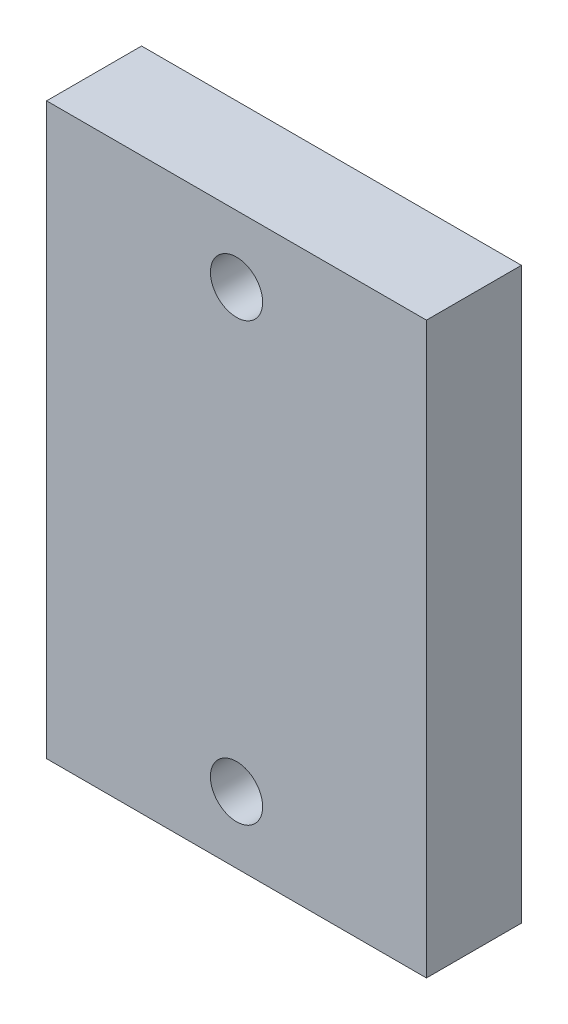
ISO-10303-21;
HEADER;
FILE_DESCRIPTION(('STEP AP214'),'2;1');
FILE_NAME('part.step','',(''),(''),'','','');
FILE_SCHEMA(('AUTOMOTIVE_DESIGN { 1 0 10303 214 1 1 1 1 }'));
ENDSEC;
DATA;
#1=APPLICATION_CONTEXT('core data for automotive mechanical design processes');
#2=APPLICATION_PROTOCOL_DEFINITION('international standard','automotive_design',2000,#1);
#3=PRODUCT_CONTEXT('',#1,'mechanical');
#4=PRODUCT('Part','Part','',(#3));
#5=PRODUCT_RELATED_PRODUCT_CATEGORY('part','',(#4));
#6=PRODUCT_DEFINITION_FORMATION('','',#4);
#7=PRODUCT_DEFINITION_CONTEXT('part definition',#1,'design');
#8=PRODUCT_DEFINITION('design','',#6,#7);
#9=PRODUCT_DEFINITION_SHAPE('','',#8);
#10=(LENGTH_UNIT() NAMED_UNIT(*) SI_UNIT(.MILLI.,.METRE.));
#11=(NAMED_UNIT(*) PLANE_ANGLE_UNIT() SI_UNIT($,.RADIAN.));
#12=(NAMED_UNIT(*) SI_UNIT($,.STERADIAN.) SOLID_ANGLE_UNIT());
#13=UNCERTAINTY_MEASURE_WITH_UNIT(LENGTH_MEASURE(1.E-05),#10,'distance_accuracy_value','');
#14=(GEOMETRIC_REPRESENTATION_CONTEXT(3) GLOBAL_UNCERTAINTY_ASSIGNED_CONTEXT((#13)) GLOBAL_UNIT_ASSIGNED_CONTEXT((#10,
#11,#12)) REPRESENTATION_CONTEXT('',''));
#15=CARTESIAN_POINT('',(0.,0.,0.));
#16=DIRECTION('',(0.,0.,1.));
#17=DIRECTION('',(1.,0.,0.));
#18=AXIS2_PLACEMENT_3D('',#15,#16,#17);
#19=CARTESIAN_POINT('',(20.,-30.,10.));
#20=DIRECTION('',(-1.,0.,0.));
#21=DIRECTION('',(0.,0.,1.));
#22=AXIS2_PLACEMENT_3D('',#19,#20,#21);
#23=PLANE('',#22);
#24=DIRECTION('',(0.,1.,0.));
#25=VECTOR('',#24,1.);
#26=CARTESIAN_POINT('',(20.,-30.,0.));
#27=LINE('',#26,#25);
#28=CARTESIAN_POINT('',(20.,-30.,0.));
#29=VERTEX_POINT('',#28);
#30=CARTESIAN_POINT('',(20.,30.,0.));
#31=VERTEX_POINT('',#30);
#32=EDGE_CURVE('E112',#29,#31,#27,.T.);
#33=ORIENTED_EDGE('',*,*,#32,.T.);
#34=DIRECTION('',(0.,0.,-1.));
#35=VECTOR('',#34,1.);
#36=CARTESIAN_POINT('',(20.,30.,10.));
#37=LINE('',#36,#35);
#38=CARTESIAN_POINT('',(20.,30.,10.));
#39=VERTEX_POINT('',#38);
#40=EDGE_CURVE('E11',#39,#31,#37,.T.);
#41=ORIENTED_EDGE('',*,*,#40,.F.);
#42=DIRECTION('',(0.,1.,0.));
#43=VECTOR('',#42,1.);
#44=CARTESIAN_POINT('',(20.,-30.,10.));
#45=LINE('',#44,#43);
#46=CARTESIAN_POINT('',(20.,-30.,10.));
#47=VERTEX_POINT('',#46);
#48=EDGE_CURVE('E96',#47,#39,#45,.T.);
#49=ORIENTED_EDGE('',*,*,#48,.F.);
#50=DIRECTION('',(0.,0.,-1.));
#51=VECTOR('',#50,1.);
#52=CARTESIAN_POINT('',(20.,-30.,10.));
#53=LINE('',#52,#51);
#54=EDGE_CURVE('E108',#47,#29,#53,.T.);
#55=ORIENTED_EDGE('',*,*,#54,.T.);
#56=EDGE_LOOP('',(#33,#41,#49,#55));
#57=FACE_BOUND('',#56,.T.);
#58=ADVANCED_FACE('F44',(#57),#23,.F.);
#59=CARTESIAN_POINT('',(-20.,30.,10.));
#60=DIRECTION('',(0.,-1.,0.));
#61=DIRECTION('',(0.,0.,-1.));
#62=AXIS2_PLACEMENT_3D('',#59,#60,#61);
#63=PLANE('',#62);
#64=DIRECTION('',(-1.,0.,0.));
#65=VECTOR('',#64,1.);
#66=CARTESIAN_POINT('',(-20.,30.,0.));
#67=LINE('',#66,#65);
#68=CARTESIAN_POINT('',(-20.,30.,0.));
#69=VERTEX_POINT('',#68);
#70=EDGE_CURVE('E101',#31,#69,#67,.T.);
#71=ORIENTED_EDGE('',*,*,#70,.T.);
#72=DIRECTION('',(0.,0.,-1.));
#73=VECTOR('',#72,1.);
#74=CARTESIAN_POINT('',(-20.,30.,10.));
#75=LINE('',#74,#73);
#76=CARTESIAN_POINT('',(-20.,30.,10.));
#77=VERTEX_POINT('',#76);
#78=EDGE_CURVE('E53',#77,#69,#75,.T.);
#79=ORIENTED_EDGE('',*,*,#78,.F.);
#80=DIRECTION('',(-1.,0.,0.));
#81=VECTOR('',#80,1.);
#82=CARTESIAN_POINT('',(-20.,30.,10.));
#83=LINE('',#82,#81);
#84=EDGE_CURVE('E91',#39,#77,#83,.T.);
#85=ORIENTED_EDGE('',*,*,#84,.F.);
#86=ORIENTED_EDGE('',*,*,#40,.T.);
#87=EDGE_LOOP('',(#71,#79,#85,#86));
#88=FACE_BOUND('',#87,.T.);
#89=ADVANCED_FACE('F100',(#88),#63,.F.);
#90=CARTESIAN_POINT('',(-20.,-30.,10.));
#91=DIRECTION('',(1.,0.,0.));
#92=DIRECTION('',(0.,0.,-1.));
#93=AXIS2_PLACEMENT_3D('',#90,#91,#92);
#94=PLANE('',#93);
#95=DIRECTION('',(0.,-1.,0.));
#96=VECTOR('',#95,1.);
#97=CARTESIAN_POINT('',(-20.,-30.,0.));
#98=LINE('',#97,#96);
#99=CARTESIAN_POINT('',(-20.,-30.,0.));
#100=VERTEX_POINT('',#99);
#101=EDGE_CURVE('E78',#69,#100,#98,.T.);
#102=ORIENTED_EDGE('',*,*,#101,.T.);
#103=DIRECTION('',(0.,0.,-1.));
#104=VECTOR('',#103,1.);
#105=CARTESIAN_POINT('',(-20.,-30.,10.));
#106=LINE('',#105,#104);
#107=CARTESIAN_POINT('',(-20.,-30.,10.));
#108=VERTEX_POINT('',#107);
#109=EDGE_CURVE('E103',#108,#100,#106,.T.);
#110=ORIENTED_EDGE('',*,*,#109,.F.);
#111=DIRECTION('',(0.,-1.,0.));
#112=VECTOR('',#111,1.);
#113=CARTESIAN_POINT('',(-20.,-30.,10.));
#114=LINE('',#113,#112);
#115=EDGE_CURVE('E94',#77,#108,#114,.T.);
#116=ORIENTED_EDGE('',*,*,#115,.F.);
#117=ORIENTED_EDGE('',*,*,#78,.T.);
#118=EDGE_LOOP('',(#102,#110,#116,#117));
#119=FACE_BOUND('',#118,.T.);
#120=ADVANCED_FACE('F104',(#119),#94,.F.);
#121=CARTESIAN_POINT('',(-20.,-30.,10.));
#122=DIRECTION('',(0.,1.,0.));
#123=DIRECTION('',(0.,0.,1.));
#124=AXIS2_PLACEMENT_3D('',#121,#122,#123);
#125=PLANE('',#124);
#126=DIRECTION('',(1.,0.,0.));
#127=VECTOR('',#126,1.);
#128=CARTESIAN_POINT('',(-20.,-30.,0.));
#129=LINE('',#128,#127);
#130=EDGE_CURVE('E84',#100,#29,#129,.T.);
#131=ORIENTED_EDGE('',*,*,#130,.T.);
#132=ORIENTED_EDGE('',*,*,#54,.F.);
#133=DIRECTION('',(1.,0.,0.));
#134=VECTOR('',#133,1.);
#135=CARTESIAN_POINT('',(-20.,-30.,10.));
#136=LINE('',#135,#134);
#137=EDGE_CURVE('E61',#108,#47,#136,.T.);
#138=ORIENTED_EDGE('',*,*,#137,.F.);
#139=ORIENTED_EDGE('',*,*,#109,.T.);
#140=EDGE_LOOP('',(#131,#132,#138,#139));
#141=FACE_BOUND('',#140,.T.);
#142=ADVANCED_FACE('F126',(#141),#125,.F.);
#143=CARTESIAN_POINT('',(0.,0.,10.));
#144=DIRECTION('',(0.,0.,-1.));
#145=DIRECTION('',(-1.,0.,0.));
#146=AXIS2_PLACEMENT_3D('',#143,#144,#145);
#147=PLANE('',#146);
#148=CARTESIAN_POINT('',(0.,-23.,10.));
#149=DIRECTION('',(0.,0.,1.));
#150=DIRECTION('',(1.,0.,0.));
#151=AXIS2_PLACEMENT_3D('',#148,#149,#150);
#152=CIRCLE('',#151,2.75);
#153=CARTESIAN_POINT('',(2.75,-23.,10.));
#154=VERTEX_POINT('',#153);
#155=EDGE_CURVE('E141',#154,#154,#152,.T.);
#156=ORIENTED_EDGE('',*,*,#155,.F.);
#157=EDGE_LOOP('',(#156));
#158=FACE_BOUND('',#157,.T.);
#159=CARTESIAN_POINT('',(0.,23.,10.));
#160=DIRECTION('',(0.,0.,1.));
#161=DIRECTION('',(1.,0.,0.));
#162=AXIS2_PLACEMENT_3D('',#159,#160,#161);
#163=CIRCLE('',#162,2.75);
#164=CARTESIAN_POINT('',(2.75,23.,10.));
#165=VERTEX_POINT('',#164);
#166=EDGE_CURVE('E137',#165,#165,#163,.T.);
#167=ORIENTED_EDGE('',*,*,#166,.F.);
#168=EDGE_LOOP('',(#167));
#169=FACE_BOUND('',#168,.T.);
#170=ORIENTED_EDGE('',*,*,#48,.T.);
#171=ORIENTED_EDGE('',*,*,#84,.T.);
#172=ORIENTED_EDGE('',*,*,#115,.T.);
#173=ORIENTED_EDGE('',*,*,#137,.T.);
#174=EDGE_LOOP('',(#170,#171,#172,#173));
#175=FACE_BOUND('',#174,.T.);
#176=ADVANCED_FACE('F92',(#158,#169,#175),#147,.F.);
#177=CARTESIAN_POINT('',(0.,0.,0.));
#178=DIRECTION('',(0.,0.,-1.));
#179=DIRECTION('',(-1.,0.,0.));
#180=AXIS2_PLACEMENT_3D('',#177,#178,#179);
#181=PLANE('',#180);
#182=CARTESIAN_POINT('',(0.,-23.,0.));
#183=DIRECTION('',(0.,0.,1.));
#184=DIRECTION('',(1.,0.,0.));
#185=AXIS2_PLACEMENT_3D('',#182,#183,#184);
#186=CIRCLE('',#185,2.75);
#187=CARTESIAN_POINT('',(2.75,-23.,0.));
#188=VERTEX_POINT('',#187);
#189=EDGE_CURVE('E116',#188,#188,#186,.T.);
#190=ORIENTED_EDGE('',*,*,#189,.T.);
#191=EDGE_LOOP('',(#190));
#192=FACE_BOUND('',#191,.T.);
#193=CARTESIAN_POINT('',(0.,23.,0.));
#194=DIRECTION('',(0.,0.,1.));
#195=DIRECTION('',(1.,0.,0.));
#196=AXIS2_PLACEMENT_3D('',#193,#194,#195);
#197=CIRCLE('',#196,2.75);
#198=CARTESIAN_POINT('',(2.75,23.,0.));
#199=VERTEX_POINT('',#198);
#200=EDGE_CURVE('E133',#199,#199,#197,.T.);
#201=ORIENTED_EDGE('',*,*,#200,.T.);
#202=EDGE_LOOP('',(#201));
#203=FACE_BOUND('',#202,.T.);
#204=ORIENTED_EDGE('',*,*,#32,.F.);
#205=ORIENTED_EDGE('',*,*,#130,.F.);
#206=ORIENTED_EDGE('',*,*,#101,.F.);
#207=ORIENTED_EDGE('',*,*,#70,.F.);
#208=EDGE_LOOP('',(#204,#205,#206,#207));
#209=FACE_BOUND('',#208,.T.);
#210=ADVANCED_FACE('F129',(#192,#203,#209),#181,.T.);
#211=CARTESIAN_POINT('',(0.,23.,0.));
#212=DIRECTION('',(0.,0.,1.));
#213=DIRECTION('',(1.,0.,0.));
#214=AXIS2_PLACEMENT_3D('',#211,#212,#213);
#215=CYLINDRICAL_SURFACE('',#214,2.75);
#216=ORIENTED_EDGE('',*,*,#200,.F.);
#217=EDGE_LOOP('',(#216));
#218=FACE_BOUND('',#217,.T.);
#219=ORIENTED_EDGE('',*,*,#166,.T.);
#220=EDGE_LOOP('',(#219));
#221=FACE_BOUND('',#220,.T.);
#222=ADVANCED_FACE('F154',(#218,#221),#215,.F.);
#223=CARTESIAN_POINT('',(0.,-23.,0.));
#224=DIRECTION('',(0.,0.,1.));
#225=DIRECTION('',(1.,0.,0.));
#226=AXIS2_PLACEMENT_3D('',#223,#224,#225);
#227=CYLINDRICAL_SURFACE('',#226,2.75);
#228=ORIENTED_EDGE('',*,*,#189,.F.);
#229=EDGE_LOOP('',(#228));
#230=FACE_BOUND('',#229,.T.);
#231=ORIENTED_EDGE('',*,*,#155,.T.);
#232=EDGE_LOOP('',(#231));
#233=FACE_BOUND('',#232,.T.);
#234=ADVANCED_FACE('F151',(#230,#233),#227,.F.);
#235=CLOSED_SHELL('',(#58,#89,#120,#142,#176,#210,#222,#234));
#236=MANIFOLD_SOLID_BREP('B2',#235);
#237=ADVANCED_BREP_SHAPE_REPRESENTATION('',(#18,#236),#14);
#238=SHAPE_DEFINITION_REPRESENTATION(#9,#237);
ENDSEC;
END-ISO-10303-21;
